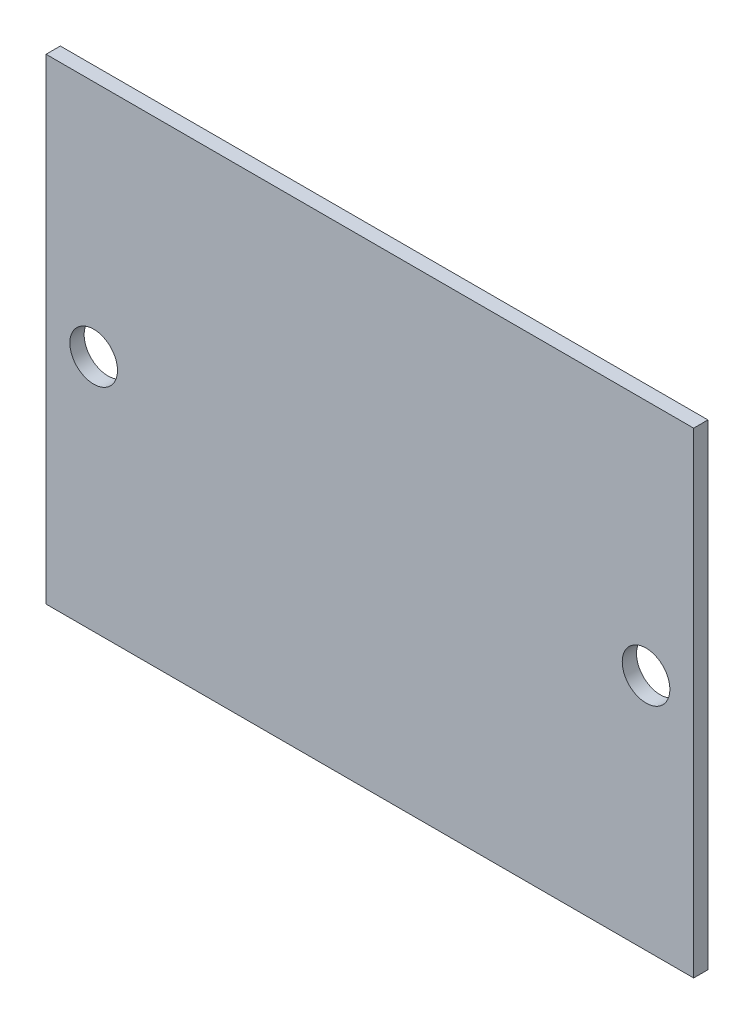
ISO-10303-21;
HEADER;
FILE_DESCRIPTION(('STEP AP214'),'2;1');
FILE_NAME('part.step','',(''),(''),'','','');
FILE_SCHEMA(('AUTOMOTIVE_DESIGN { 1 0 10303 214 1 1 1 1 }'));
ENDSEC;
DATA;
#1=APPLICATION_CONTEXT('core data for automotive mechanical design processes');
#2=APPLICATION_PROTOCOL_DEFINITION('international standard','automotive_design',2000,#1);
#3=PRODUCT_CONTEXT('',#1,'mechanical');
#4=PRODUCT('Part','Part','',(#3));
#5=PRODUCT_RELATED_PRODUCT_CATEGORY('part','',(#4));
#6=PRODUCT_DEFINITION_FORMATION('','',#4);
#7=PRODUCT_DEFINITION_CONTEXT('part definition',#1,'design');
#8=PRODUCT_DEFINITION('design','',#6,#7);
#9=PRODUCT_DEFINITION_SHAPE('','',#8);
#10=(LENGTH_UNIT() NAMED_UNIT(*) SI_UNIT(.MILLI.,.METRE.));
#11=(NAMED_UNIT(*) PLANE_ANGLE_UNIT() SI_UNIT($,.RADIAN.));
#12=(NAMED_UNIT(*) SI_UNIT($,.STERADIAN.) SOLID_ANGLE_UNIT());
#13=UNCERTAINTY_MEASURE_WITH_UNIT(LENGTH_MEASURE(1.E-05),#10,'distance_accuracy_value','');
#14=(GEOMETRIC_REPRESENTATION_CONTEXT(3) GLOBAL_UNCERTAINTY_ASSIGNED_CONTEXT((#13)) GLOBAL_UNIT_ASSIGNED_CONTEXT((#10,
#11,#12)) REPRESENTATION_CONTEXT('',''));
#15=CARTESIAN_POINT('',(0.,0.,0.));
#16=DIRECTION('',(0.,0.,1.));
#17=DIRECTION('',(1.,0.,0.));
#18=AXIS2_PLACEMENT_3D('',#15,#16,#17);
#19=CARTESIAN_POINT('',(0.,0.,1.5));
#20=DIRECTION('',(0.,0.,1.));
#21=DIRECTION('',(1.,0.,0.));
#22=AXIS2_PLACEMENT_3D('',#19,#20,#21);
#23=PLANE('',#22);
#24=CARTESIAN_POINT('',(-29.,0.,1.5));
#25=DIRECTION('',(0.,0.,1.));
#26=DIRECTION('',(1.,0.,0.));
#27=AXIS2_PLACEMENT_3D('',#24,#25,#26);
#28=CIRCLE('',#27,2.5);
#29=CARTESIAN_POINT('',(-26.5,0.,1.5));
#30=VERTEX_POINT('',#29);
#31=EDGE_CURVE('E104',#30,#30,#28,.T.);
#32=ORIENTED_EDGE('',*,*,#31,.F.);
#33=EDGE_LOOP('',(#32));
#34=FACE_BOUND('',#33,.T.);
#35=DIRECTION('',(0.,1.,0.));
#36=VECTOR('',#35,1.);
#37=CARTESIAN_POINT('',(34.,25.,1.5));
#38=LINE('',#37,#36);
#39=CARTESIAN_POINT('',(34.,-25.,1.5));
#40=VERTEX_POINT('',#39);
#41=CARTESIAN_POINT('',(34.,25.,1.5));
#42=VERTEX_POINT('',#41);
#43=EDGE_CURVE('E89',#40,#42,#38,.T.);
#44=ORIENTED_EDGE('',*,*,#43,.T.);
#45=DIRECTION('',(-1.,0.,0.));
#46=VECTOR('',#45,1.);
#47=CARTESIAN_POINT('',(-34.,25.,1.5));
#48=LINE('',#47,#46);
#49=CARTESIAN_POINT('',(-34.,25.,1.5));
#50=VERTEX_POINT('',#49);
#51=EDGE_CURVE('E84',#42,#50,#48,.T.);
#52=ORIENTED_EDGE('',*,*,#51,.T.);
#53=DIRECTION('',(0.,-1.,0.));
#54=VECTOR('',#53,1.);
#55=CARTESIAN_POINT('',(-34.,25.,1.5));
#56=LINE('',#55,#54);
#57=CARTESIAN_POINT('',(-34.,-25.,1.5));
#58=VERTEX_POINT('',#57);
#59=EDGE_CURVE('E87',#50,#58,#56,.T.);
#60=ORIENTED_EDGE('',*,*,#59,.T.);
#61=DIRECTION('',(1.,0.,0.));
#62=VECTOR('',#61,1.);
#63=CARTESIAN_POINT('',(-34.,-25.,1.5));
#64=LINE('',#63,#62);
#65=EDGE_CURVE('E54',#58,#40,#64,.T.);
#66=ORIENTED_EDGE('',*,*,#65,.T.);
#67=EDGE_LOOP('',(#44,#52,#60,#66));
#68=FACE_BOUND('',#67,.T.);
#69=CARTESIAN_POINT('',(29.,0.,1.5));
#70=DIRECTION('',(0.,0.,1.));
#71=DIRECTION('',(-1.,0.,0.));
#72=AXIS2_PLACEMENT_3D('',#69,#70,#71);
#73=CIRCLE('',#72,2.49999999999999);
#74=CARTESIAN_POINT('',(26.5,0.,1.5));
#75=VERTEX_POINT('',#74);
#76=EDGE_CURVE('E119',#75,#75,#73,.T.);
#77=ORIENTED_EDGE('',*,*,#76,.F.);
#78=EDGE_LOOP('',(#77));
#79=FACE_BOUND('',#78,.T.);
#80=ADVANCED_FACE('F37',(#34,#68,#79),#23,.T.);
#81=CARTESIAN_POINT('',(0.,0.,0.));
#82=DIRECTION('',(0.,0.,1.));
#83=DIRECTION('',(1.,0.,0.));
#84=AXIS2_PLACEMENT_3D('',#81,#82,#83);
#85=PLANE('',#84);
#86=DIRECTION('',(0.,1.,0.));
#87=VECTOR('',#86,1.);
#88=CARTESIAN_POINT('',(34.,25.,0.));
#89=LINE('',#88,#87);
#90=CARTESIAN_POINT('',(34.,-25.,0.));
#91=VERTEX_POINT('',#90);
#92=CARTESIAN_POINT('',(34.,25.,0.));
#93=VERTEX_POINT('',#92);
#94=EDGE_CURVE('E101',#91,#93,#89,.T.);
#95=ORIENTED_EDGE('',*,*,#94,.F.);
#96=DIRECTION('',(1.,0.,0.));
#97=VECTOR('',#96,1.);
#98=CARTESIAN_POINT('',(-34.,-25.,0.));
#99=LINE('',#98,#97);
#100=CARTESIAN_POINT('',(-34.,-25.,0.));
#101=VERTEX_POINT('',#100);
#102=EDGE_CURVE('E77',#101,#91,#99,.T.);
#103=ORIENTED_EDGE('',*,*,#102,.F.);
#104=DIRECTION('',(0.,-1.,0.));
#105=VECTOR('',#104,1.);
#106=CARTESIAN_POINT('',(-34.,25.,0.));
#107=LINE('',#106,#105);
#108=CARTESIAN_POINT('',(-34.,25.,0.));
#109=VERTEX_POINT('',#108);
#110=EDGE_CURVE('E71',#109,#101,#107,.T.);
#111=ORIENTED_EDGE('',*,*,#110,.F.);
#112=DIRECTION('',(-1.,0.,0.));
#113=VECTOR('',#112,1.);
#114=CARTESIAN_POINT('',(-34.,25.,0.));
#115=LINE('',#114,#113);
#116=EDGE_CURVE('E93',#93,#109,#115,.T.);
#117=ORIENTED_EDGE('',*,*,#116,.F.);
#118=EDGE_LOOP('',(#95,#103,#111,#117));
#119=FACE_BOUND('',#118,.T.);
#120=CARTESIAN_POINT('',(-29.,0.,0.));
#121=DIRECTION('',(0.,0.,1.));
#122=DIRECTION('',(1.,0.,0.));
#123=AXIS2_PLACEMENT_3D('',#120,#121,#122);
#124=CIRCLE('',#123,2.5);
#125=CARTESIAN_POINT('',(-26.5,0.,0.));
#126=VERTEX_POINT('',#125);
#127=EDGE_CURVE('E116',#126,#126,#124,.T.);
#128=ORIENTED_EDGE('',*,*,#127,.T.);
#129=EDGE_LOOP('',(#128));
#130=FACE_BOUND('',#129,.T.);
#131=CARTESIAN_POINT('',(29.,0.,0.));
#132=DIRECTION('',(0.,0.,1.));
#133=DIRECTION('',(-1.,0.,0.));
#134=AXIS2_PLACEMENT_3D('',#131,#132,#133);
#135=CIRCLE('',#134,2.49999999999999);
#136=CARTESIAN_POINT('',(26.5,0.,0.));
#137=VERTEX_POINT('',#136);
#138=EDGE_CURVE('E122',#137,#137,#135,.T.);
#139=ORIENTED_EDGE('',*,*,#138,.T.);
#140=EDGE_LOOP('',(#139));
#141=FACE_BOUND('',#140,.T.);
#142=ADVANCED_FACE('F112',(#119,#130,#141),#85,.F.);
#143=CARTESIAN_POINT('',(34.,25.,1.5));
#144=DIRECTION('',(-1.,0.,0.));
#145=DIRECTION('',(0.,-1.,0.));
#146=AXIS2_PLACEMENT_3D('',#143,#144,#145);
#147=PLANE('',#146);
#148=ORIENTED_EDGE('',*,*,#94,.T.);
#149=DIRECTION('',(0.,0.,-1.));
#150=VECTOR('',#149,1.);
#151=CARTESIAN_POINT('',(34.,25.,1.5));
#152=LINE('',#151,#150);
#153=EDGE_CURVE('E11',#42,#93,#152,.T.);
#154=ORIENTED_EDGE('',*,*,#153,.F.);
#155=ORIENTED_EDGE('',*,*,#43,.F.);
#156=DIRECTION('',(0.,0.,-1.));
#157=VECTOR('',#156,1.);
#158=CARTESIAN_POINT('',(34.,-25.,1.5));
#159=LINE('',#158,#157);
#160=EDGE_CURVE('E97',#40,#91,#159,.T.);
#161=ORIENTED_EDGE('',*,*,#160,.T.);
#162=EDGE_LOOP('',(#148,#154,#155,#161));
#163=FACE_BOUND('',#162,.T.);
#164=ADVANCED_FACE('F39',(#163),#147,.F.);
#165=CARTESIAN_POINT('',(-34.,25.,1.5));
#166=DIRECTION('',(0.,-1.,0.));
#167=DIRECTION('',(0.,0.,-1.));
#168=AXIS2_PLACEMENT_3D('',#165,#166,#167);
#169=PLANE('',#168);
#170=ORIENTED_EDGE('',*,*,#116,.T.);
#171=DIRECTION('',(0.,0.,-1.));
#172=VECTOR('',#171,1.);
#173=CARTESIAN_POINT('',(-34.,25.,1.5));
#174=LINE('',#173,#172);
#175=EDGE_CURVE('E46',#50,#109,#174,.T.);
#176=ORIENTED_EDGE('',*,*,#175,.F.);
#177=ORIENTED_EDGE('',*,*,#51,.F.);
#178=ORIENTED_EDGE('',*,*,#153,.T.);
#179=EDGE_LOOP('',(#170,#176,#177,#178));
#180=FACE_BOUND('',#179,.T.);
#181=ADVANCED_FACE('F92',(#180),#169,.F.);
#182=CARTESIAN_POINT('',(-34.,25.,1.5));
#183=DIRECTION('',(1.,0.,0.));
#184=DIRECTION('',(0.,1.,0.));
#185=AXIS2_PLACEMENT_3D('',#182,#183,#184);
#186=PLANE('',#185);
#187=ORIENTED_EDGE('',*,*,#110,.T.);
#188=DIRECTION('',(0.,0.,-1.));
#189=VECTOR('',#188,1.);
#190=CARTESIAN_POINT('',(-34.,-25.,1.5));
#191=LINE('',#190,#189);
#192=EDGE_CURVE('E94',#58,#101,#191,.T.);
#193=ORIENTED_EDGE('',*,*,#192,.F.);
#194=ORIENTED_EDGE('',*,*,#59,.F.);
#195=ORIENTED_EDGE('',*,*,#175,.T.);
#196=EDGE_LOOP('',(#187,#193,#194,#195));
#197=FACE_BOUND('',#196,.T.);
#198=ADVANCED_FACE('F95',(#197),#186,.F.);
#199=CARTESIAN_POINT('',(-34.,-25.,1.5));
#200=DIRECTION('',(0.,1.,0.));
#201=DIRECTION('',(0.,0.,1.));
#202=AXIS2_PLACEMENT_3D('',#199,#200,#201);
#203=PLANE('',#202);
#204=ORIENTED_EDGE('',*,*,#102,.T.);
#205=ORIENTED_EDGE('',*,*,#160,.F.);
#206=ORIENTED_EDGE('',*,*,#65,.F.);
#207=ORIENTED_EDGE('',*,*,#192,.T.);
#208=EDGE_LOOP('',(#204,#205,#206,#207));
#209=FACE_BOUND('',#208,.T.);
#210=ADVANCED_FACE('F109',(#209),#203,.F.);
#211=CARTESIAN_POINT('',(-29.,0.,1.5));
#212=DIRECTION('',(0.,0.,-1.));
#213=DIRECTION('',(-1.,0.,0.));
#214=AXIS2_PLACEMENT_3D('',#211,#212,#213);
#215=CYLINDRICAL_SURFACE('',#214,2.5);
#216=ORIENTED_EDGE('',*,*,#31,.T.);
#217=EDGE_LOOP('',(#216));
#218=FACE_BOUND('',#217,.T.);
#219=ORIENTED_EDGE('',*,*,#127,.F.);
#220=EDGE_LOOP('',(#219));
#221=FACE_BOUND('',#220,.T.);
#222=ADVANCED_FACE('F139',(#218,#221),#215,.F.);
#223=CARTESIAN_POINT('',(29.,0.,1.5));
#224=DIRECTION('',(0.,0.,-1.));
#225=DIRECTION('',(-1.,0.,0.));
#226=AXIS2_PLACEMENT_3D('',#223,#224,#225);
#227=CYLINDRICAL_SURFACE('',#226,2.49999999999999);
#228=ORIENTED_EDGE('',*,*,#76,.T.);
#229=EDGE_LOOP('',(#228));
#230=FACE_BOUND('',#229,.T.);
#231=ORIENTED_EDGE('',*,*,#138,.F.);
#232=EDGE_LOOP('',(#231));
#233=FACE_BOUND('',#232,.T.);
#234=ADVANCED_FACE('F128',(#230,#233),#227,.F.);
#235=CLOSED_SHELL('',(#80,#142,#164,#181,#198,#210,#222,#234));
#236=MANIFOLD_SOLID_BREP('B2',#235);
#237=ADVANCED_BREP_SHAPE_REPRESENTATION('',(#18,#236),#14);
#238=SHAPE_DEFINITION_REPRESENTATION(#9,#237);
ENDSEC;
END-ISO-10303-21;
